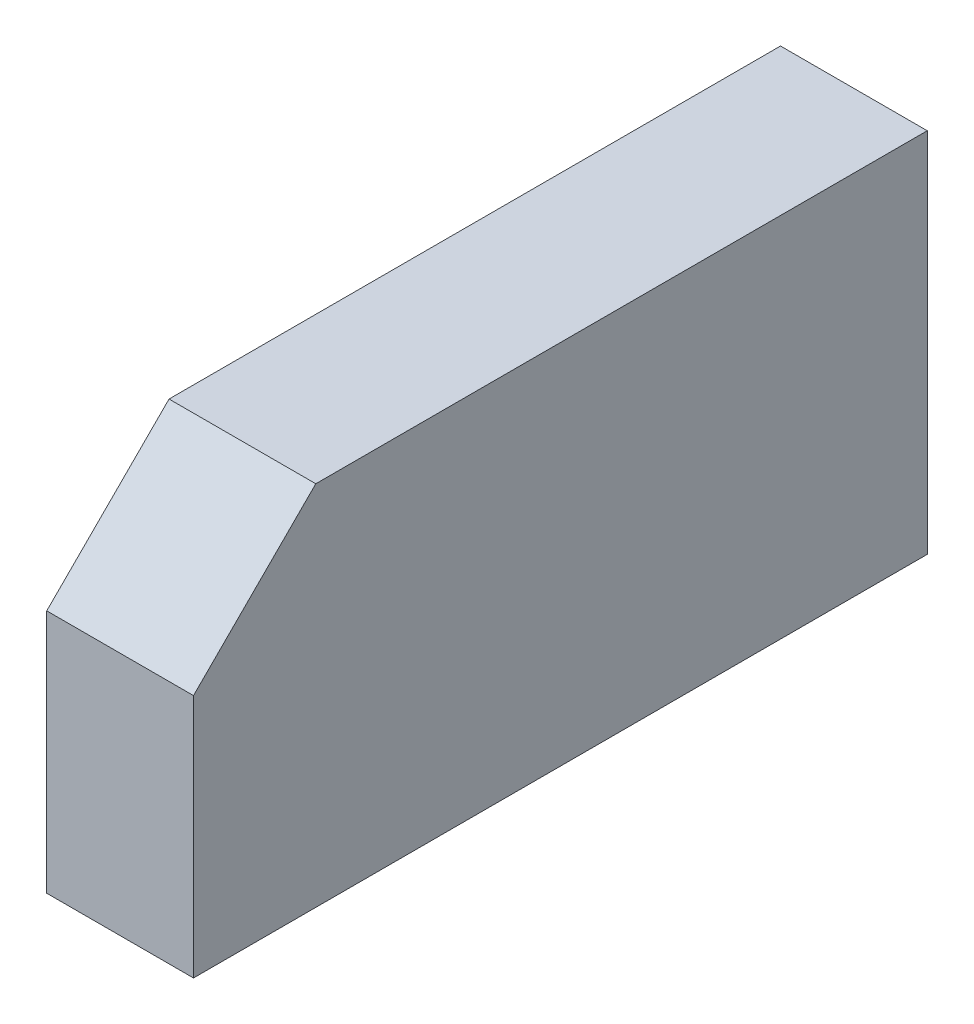
ISO-10303-21;
HEADER;
FILE_DESCRIPTION(('STEP AP214'),'2;1');
FILE_NAME('part.step','',(''),(''),'','','');
FILE_SCHEMA(('AUTOMOTIVE_DESIGN { 1 0 10303 214 1 1 1 1 }'));
ENDSEC;
DATA;
#1=APPLICATION_CONTEXT('core data for automotive mechanical design processes');
#2=APPLICATION_PROTOCOL_DEFINITION('international standard','automotive_design',2000,#1);
#3=PRODUCT_CONTEXT('',#1,'mechanical');
#4=PRODUCT('Part','Part','',(#3));
#5=PRODUCT_RELATED_PRODUCT_CATEGORY('part','',(#4));
#6=PRODUCT_DEFINITION_FORMATION('','',#4);
#7=PRODUCT_DEFINITION_CONTEXT('part definition',#1,'design');
#8=PRODUCT_DEFINITION('design','',#6,#7);
#9=PRODUCT_DEFINITION_SHAPE('','',#8);
#10=(LENGTH_UNIT() NAMED_UNIT(*) SI_UNIT(.MILLI.,.METRE.));
#11=(NAMED_UNIT(*) PLANE_ANGLE_UNIT() SI_UNIT($,.RADIAN.));
#12=(NAMED_UNIT(*) SI_UNIT($,.STERADIAN.) SOLID_ANGLE_UNIT());
#13=UNCERTAINTY_MEASURE_WITH_UNIT(LENGTH_MEASURE(1.E-05),#10,'distance_accuracy_value','');
#14=(GEOMETRIC_REPRESENTATION_CONTEXT(3) GLOBAL_UNCERTAINTY_ASSIGNED_CONTEXT((#13)) GLOBAL_UNIT_ASSIGNED_CONTEXT((#10,
#11,#12)) REPRESENTATION_CONTEXT('',''));
#15=CARTESIAN_POINT('',(0.,0.,0.));
#16=DIRECTION('',(0.,0.,1.));
#17=DIRECTION('',(1.,0.,0.));
#18=AXIS2_PLACEMENT_3D('',#15,#16,#17);
#19=CARTESIAN_POINT('',(0.,15.,-30.));
#20=DIRECTION('',(1.,0.,0.));
#21=DIRECTION('',(0.,0.,-1.));
#22=AXIS2_PLACEMENT_3D('',#19,#20,#21);
#23=PLANE('',#22);
#24=DIRECTION('',(0.,-1.,0.));
#25=VECTOR('',#24,1.);
#26=CARTESIAN_POINT('',(0.,15.,0.));
#27=LINE('',#26,#25);
#28=CARTESIAN_POINT('',(0.,9.99999999999998,0.));
#29=VERTEX_POINT('',#28);
#30=CARTESIAN_POINT('',(0.,0.,0.));
#31=VERTEX_POINT('',#30);
#32=EDGE_CURVE('E126',#29,#31,#27,.T.);
#33=ORIENTED_EDGE('',*,*,#32,.F.);
#34=DIRECTION('',(0.,0.707106781186549,-0.707106781186546));
#35=VECTOR('',#34,1.);
#36=CARTESIAN_POINT('',(0.,15.,-5.));
#37=LINE('',#36,#35);
#38=CARTESIAN_POINT('',(0.,15.,-5.));
#39=VERTEX_POINT('',#38);
#40=EDGE_CURVE('E11',#29,#39,#37,.T.);
#41=ORIENTED_EDGE('',*,*,#40,.T.);
#42=DIRECTION('',(0.,0.,1.));
#43=VECTOR('',#42,1.);
#44=CARTESIAN_POINT('',(0.,15.,-30.));
#45=LINE('',#44,#43);
#46=CARTESIAN_POINT('',(0.,15.,-30.));
#47=VERTEX_POINT('',#46);
#48=EDGE_CURVE('E97',#47,#39,#45,.T.);
#49=ORIENTED_EDGE('',*,*,#48,.F.);
#50=DIRECTION('',(0.,-1.,0.));
#51=VECTOR('',#50,1.);
#52=CARTESIAN_POINT('',(0.,15.,-30.));
#53=LINE('',#52,#51);
#54=CARTESIAN_POINT('',(0.,0.,-30.));
#55=VERTEX_POINT('',#54);
#56=EDGE_CURVE('E107',#47,#55,#53,.T.);
#57=ORIENTED_EDGE('',*,*,#56,.T.);
#58=DIRECTION('',(0.,0.,1.));
#59=VECTOR('',#58,1.);
#60=CARTESIAN_POINT('',(0.,0.,-30.));
#61=LINE('',#60,#59);
#62=EDGE_CURVE('E116',#55,#31,#61,.T.);
#63=ORIENTED_EDGE('',*,*,#62,.T.);
#64=EDGE_LOOP('',(#33,#41,#49,#57,#63));
#65=FACE_BOUND('',#64,.T.);
#66=ADVANCED_FACE('F43',(#65),#23,.F.);
#67=CARTESIAN_POINT('',(0.,15.,0.));
#68=DIRECTION('',(0.,0.,-1.));
#69=DIRECTION('',(-1.,0.,0.));
#70=AXIS2_PLACEMENT_3D('',#67,#68,#69);
#71=PLANE('',#70);
#72=DIRECTION('',(0.,-1.,0.));
#73=VECTOR('',#72,1.);
#74=CARTESIAN_POINT('',(5.99999999999999,15.,0.));
#75=LINE('',#74,#73);
#76=CARTESIAN_POINT('',(5.99999999999999,9.99999999999998,0.));
#77=VERTEX_POINT('',#76);
#78=CARTESIAN_POINT('',(5.99999999999999,0.,0.));
#79=VERTEX_POINT('',#78);
#80=EDGE_CURVE('E106',#77,#79,#75,.T.);
#81=ORIENTED_EDGE('',*,*,#80,.F.);
#82=DIRECTION('',(-1.,0.,0.));
#83=VECTOR('',#82,1.);
#84=CARTESIAN_POINT('',(0.,9.99999999999998,0.));
#85=LINE('',#84,#83);
#86=EDGE_CURVE('E52',#77,#29,#85,.T.);
#87=ORIENTED_EDGE('',*,*,#86,.T.);
#88=ORIENTED_EDGE('',*,*,#32,.T.);
#89=DIRECTION('',(1.,0.,0.));
#90=VECTOR('',#89,1.);
#91=CARTESIAN_POINT('',(0.,0.,0.));
#92=LINE('',#91,#90);
#93=EDGE_CURVE('E119',#31,#79,#92,.T.);
#94=ORIENTED_EDGE('',*,*,#93,.T.);
#95=EDGE_LOOP('',(#81,#87,#88,#94));
#96=FACE_BOUND('',#95,.T.);
#97=ADVANCED_FACE('F130',(#96),#71,.F.);
#98=CARTESIAN_POINT('',(5.99999999999999,15.,-30.));
#99=DIRECTION('',(-1.,0.,0.));
#100=DIRECTION('',(0.,0.,1.));
#101=AXIS2_PLACEMENT_3D('',#98,#99,#100);
#102=PLANE('',#101);
#103=DIRECTION('',(0.,0.,-1.));
#104=VECTOR('',#103,1.);
#105=CARTESIAN_POINT('',(5.99999999999999,15.,-30.));
#106=LINE('',#105,#104);
#107=CARTESIAN_POINT('',(5.99999999999999,15.,-5.));
#108=VERTEX_POINT('',#107);
#109=CARTESIAN_POINT('',(5.99999999999999,15.,-30.));
#110=VERTEX_POINT('',#109);
#111=EDGE_CURVE('E88',#108,#110,#106,.T.);
#112=ORIENTED_EDGE('',*,*,#111,.F.);
#113=DIRECTION('',(0.,-0.707106781186549,0.707106781186546));
#114=VECTOR('',#113,1.);
#115=CARTESIAN_POINT('',(5.99999999999999,15.,-5.));
#116=LINE('',#115,#114);
#117=EDGE_CURVE('E66',#108,#77,#116,.T.);
#118=ORIENTED_EDGE('',*,*,#117,.T.);
#119=ORIENTED_EDGE('',*,*,#80,.T.);
#120=DIRECTION('',(0.,0.,-1.));
#121=VECTOR('',#120,1.);
#122=CARTESIAN_POINT('',(5.99999999999999,0.,-30.));
#123=LINE('',#122,#121);
#124=CARTESIAN_POINT('',(5.99999999999999,0.,-30.));
#125=VERTEX_POINT('',#124);
#126=EDGE_CURVE('E103',#79,#125,#123,.T.);
#127=ORIENTED_EDGE('',*,*,#126,.T.);
#128=DIRECTION('',(0.,-1.,0.));
#129=VECTOR('',#128,1.);
#130=CARTESIAN_POINT('',(5.99999999999999,15.,-30.));
#131=LINE('',#130,#129);
#132=EDGE_CURVE('E100',#110,#125,#131,.T.);
#133=ORIENTED_EDGE('',*,*,#132,.F.);
#134=EDGE_LOOP('',(#112,#118,#119,#127,#133));
#135=FACE_BOUND('',#134,.T.);
#136=ADVANCED_FACE('F101',(#135),#102,.F.);
#137=CARTESIAN_POINT('',(0.,15.,-30.));
#138=DIRECTION('',(0.,0.,1.));
#139=DIRECTION('',(1.,0.,0.));
#140=AXIS2_PLACEMENT_3D('',#137,#138,#139);
#141=PLANE('',#140);
#142=DIRECTION('',(-1.,0.,0.));
#143=VECTOR('',#142,1.);
#144=CARTESIAN_POINT('',(0.,0.,-30.));
#145=LINE('',#144,#143);
#146=EDGE_CURVE('E123',#125,#55,#145,.T.);
#147=ORIENTED_EDGE('',*,*,#146,.T.);
#148=ORIENTED_EDGE('',*,*,#56,.F.);
#149=DIRECTION('',(-1.,0.,0.));
#150=VECTOR('',#149,1.);
#151=CARTESIAN_POINT('',(0.,15.,-30.));
#152=LINE('',#151,#150);
#153=EDGE_CURVE('E93',#110,#47,#152,.T.);
#154=ORIENTED_EDGE('',*,*,#153,.F.);
#155=ORIENTED_EDGE('',*,*,#132,.T.);
#156=EDGE_LOOP('',(#147,#148,#154,#155));
#157=FACE_BOUND('',#156,.T.);
#158=ADVANCED_FACE('F109',(#157),#141,.F.);
#159=CARTESIAN_POINT('',(0.,15.,0.));
#160=DIRECTION('',(0.,1.,0.));
#161=DIRECTION('',(0.,0.,1.));
#162=AXIS2_PLACEMENT_3D('',#159,#160,#161);
#163=PLANE('',#162);
#164=ORIENTED_EDGE('',*,*,#48,.T.);
#165=DIRECTION('',(1.,0.,0.));
#166=VECTOR('',#165,1.);
#167=CARTESIAN_POINT('',(5.99999999999999,15.,-5.));
#168=LINE('',#167,#166);
#169=EDGE_CURVE('E96',#39,#108,#168,.T.);
#170=ORIENTED_EDGE('',*,*,#169,.T.);
#171=ORIENTED_EDGE('',*,*,#111,.T.);
#172=ORIENTED_EDGE('',*,*,#153,.T.);
#173=EDGE_LOOP('',(#164,#170,#171,#172));
#174=FACE_BOUND('',#173,.T.);
#175=ADVANCED_FACE('F91',(#174),#163,.T.);
#176=CARTESIAN_POINT('',(0.,0.,0.));
#177=DIRECTION('',(0.,1.,0.));
#178=DIRECTION('',(0.,0.,1.));
#179=AXIS2_PLACEMENT_3D('',#176,#177,#178);
#180=PLANE('',#179);
#181=ORIENTED_EDGE('',*,*,#62,.F.);
#182=ORIENTED_EDGE('',*,*,#146,.F.);
#183=ORIENTED_EDGE('',*,*,#126,.F.);
#184=ORIENTED_EDGE('',*,*,#93,.F.);
#185=EDGE_LOOP('',(#181,#182,#183,#184));
#186=FACE_BOUND('',#185,.T.);
#187=ADVANCED_FACE('F135',(#186),#180,.F.);
#188=CARTESIAN_POINT('',(0.,15.,-5.));
#189=DIRECTION('',(0.,0.707106781186546,0.707106781186549));
#190=DIRECTION('',(-1.,0.,0.));
#191=AXIS2_PLACEMENT_3D('',#188,#189,#190);
#192=PLANE('',#191);
#193=ORIENTED_EDGE('',*,*,#40,.F.);
#194=ORIENTED_EDGE('',*,*,#86,.F.);
#195=ORIENTED_EDGE('',*,*,#117,.F.);
#196=ORIENTED_EDGE('',*,*,#169,.F.);
#197=EDGE_LOOP('',(#193,#194,#195,#196));
#198=FACE_BOUND('',#197,.T.);
#199=ADVANCED_FACE('F46',(#198),#192,.T.);
#200=CLOSED_SHELL('',(#66,#97,#136,#158,#175,#187,#199));
#201=MANIFOLD_SOLID_BREP('B2',#200);
#202=ADVANCED_BREP_SHAPE_REPRESENTATION('',(#18,#201),#14);
#203=SHAPE_DEFINITION_REPRESENTATION(#9,#202);
ENDSEC;
END-ISO-10303-21;
